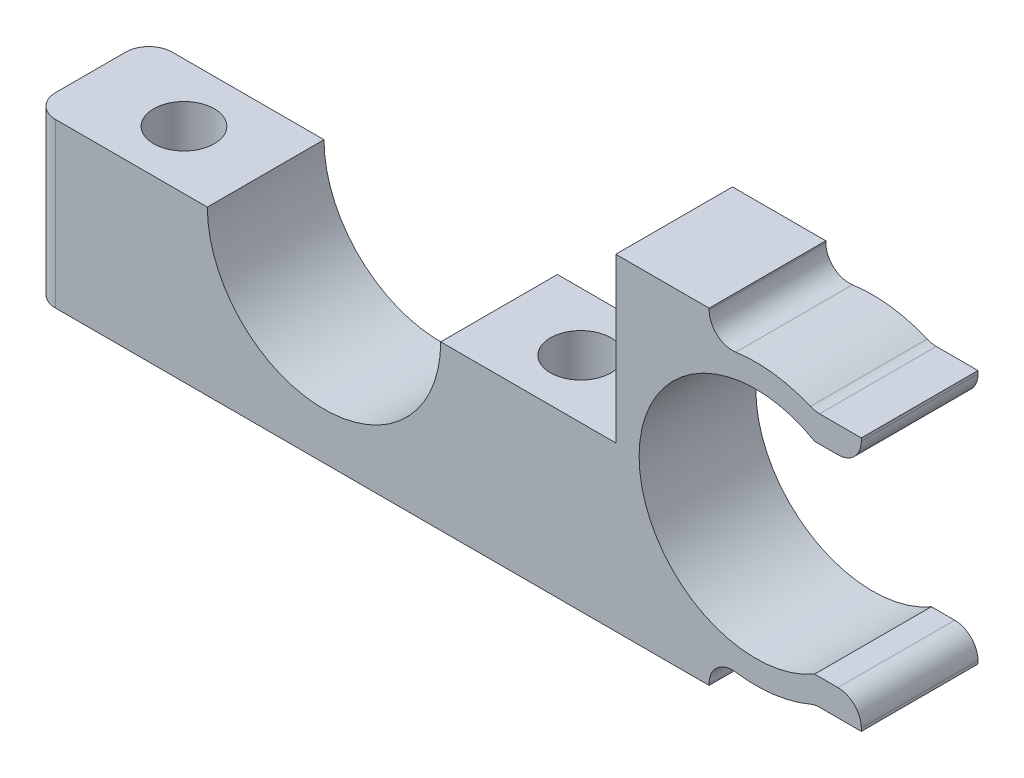
ISO-10303-21;
HEADER;
FILE_DESCRIPTION(('STEP AP214'),'2;1');
FILE_NAME('part.step','',(''),(''),'','','');
FILE_SCHEMA(('AUTOMOTIVE_DESIGN { 1 0 10303 214 1 1 1 1 }'));
ENDSEC;
DATA;
#1=APPLICATION_CONTEXT('core data for automotive mechanical design processes');
#2=APPLICATION_PROTOCOL_DEFINITION('international standard','automotive_design',2000,#1);
#3=PRODUCT_CONTEXT('',#1,'mechanical');
#4=PRODUCT('Part','Part','',(#3));
#5=PRODUCT_RELATED_PRODUCT_CATEGORY('part','',(#4));
#6=PRODUCT_DEFINITION_FORMATION('','',#4);
#7=PRODUCT_DEFINITION_CONTEXT('part definition',#1,'design');
#8=PRODUCT_DEFINITION('design','',#6,#7);
#9=PRODUCT_DEFINITION_SHAPE('','',#8);
#10=(LENGTH_UNIT() NAMED_UNIT(*) SI_UNIT(.MILLI.,.METRE.));
#11=(NAMED_UNIT(*) PLANE_ANGLE_UNIT() SI_UNIT($,.RADIAN.));
#12=(NAMED_UNIT(*) SI_UNIT($,.STERADIAN.) SOLID_ANGLE_UNIT());
#13=UNCERTAINTY_MEASURE_WITH_UNIT(LENGTH_MEASURE(1.E-05),#10,'distance_accuracy_value','');
#14=(GEOMETRIC_REPRESENTATION_CONTEXT(3) GLOBAL_UNCERTAINTY_ASSIGNED_CONTEXT((#13)) GLOBAL_UNIT_ASSIGNED_CONTEXT((#10,
#11,#12)) REPRESENTATION_CONTEXT('',''));
#15=CARTESIAN_POINT('',(0.,0.,0.));
#16=DIRECTION('',(0.,0.,1.));
#17=DIRECTION('',(1.,0.,0.));
#18=AXIS2_PLACEMENT_3D('',#15,#16,#17);
#19=CARTESIAN_POINT('',(0.,0.,10.));
#20=DIRECTION('',(0.,0.,-1.));
#21=DIRECTION('',(-1.,0.,0.));
#22=AXIS2_PLACEMENT_3D('',#19,#20,#21);
#23=CYLINDRICAL_SURFACE('',#22,10.);
#24=CARTESIAN_POINT('',(0.,0.,0.));
#25=DIRECTION('',(0.,0.,-1.));
#26=DIRECTION('',(1.,0.,0.));
#27=AXIS2_PLACEMENT_3D('',#24,#25,#26);
#28=CIRCLE('',#27,10.);
#29=CARTESIAN_POINT('',(10.,0.,0.));
#30=VERTEX_POINT('',#29);
#31=CARTESIAN_POINT('',(-10.,0.,0.));
#32=VERTEX_POINT('',#31);
#33=EDGE_CURVE('E231',#30,#32,#28,.T.);
#34=ORIENTED_EDGE('',*,*,#33,.T.);
#35=DIRECTION('',(0.,0.,-1.));
#36=VECTOR('',#35,1.);
#37=CARTESIAN_POINT('',(-10.,0.,10.));
#38=LINE('',#37,#36);
#39=CARTESIAN_POINT('',(-10.,0.,10.));
#40=VERTEX_POINT('',#39);
#41=EDGE_CURVE('E210',#40,#32,#38,.T.);
#42=ORIENTED_EDGE('',*,*,#41,.F.);
#43=CARTESIAN_POINT('',(0.,0.,10.));
#44=DIRECTION('',(0.,0.,-1.));
#45=DIRECTION('',(1.,0.,0.));
#46=AXIS2_PLACEMENT_3D('',#43,#44,#45);
#47=CIRCLE('',#46,10.);
#48=CARTESIAN_POINT('',(10.,0.,10.));
#49=VERTEX_POINT('',#48);
#50=EDGE_CURVE('E218',#49,#40,#47,.T.);
#51=ORIENTED_EDGE('',*,*,#50,.F.);
#52=DIRECTION('',(0.,0.,-1.));
#53=VECTOR('',#52,1.);
#54=CARTESIAN_POINT('',(10.,0.,10.));
#55=LINE('',#54,#53);
#56=EDGE_CURVE('E340',#49,#30,#55,.T.);
#57=ORIENTED_EDGE('',*,*,#56,.T.);
#58=EDGE_LOOP('',(#34,#42,#51,#57));
#59=FACE_BOUND('',#58,.T.);
#60=ADVANCED_FACE('F33',(#59),#23,.F.);
#61=CARTESIAN_POINT('',(-25.,0.,10.));
#62=DIRECTION('',(0.,-1.,0.));
#63=DIRECTION('',(1.,0.,0.));
#64=AXIS2_PLACEMENT_3D('',#61,#62,#63);
#65=PLANE('',#64);
#66=CARTESIAN_POINT('',(-17.,0.,5.));
#67=DIRECTION('',(0.,1.,0.));
#68=DIRECTION('',(-1.,0.,0.));
#69=AXIS2_PLACEMENT_3D('',#66,#67,#68);
#70=CIRCLE('',#69,2.6);
#71=CARTESIAN_POINT('',(-19.6,0.,5.));
#72=VERTEX_POINT('',#71);
#73=EDGE_CURVE('E761',#72,#72,#70,.T.);
#74=ORIENTED_EDGE('',*,*,#73,.F.);
#75=EDGE_LOOP('',(#74));
#76=FACE_BOUND('',#75,.T.);
#77=DIRECTION('',(-1.,0.,0.));
#78=VECTOR('',#77,1.);
#79=CARTESIAN_POINT('',(-25.,0.,0.));
#80=LINE('',#79,#78);
#81=CARTESIAN_POINT('',(-23.,0.,0.));
#82=VERTEX_POINT('',#81);
#83=EDGE_CURVE('E342',#32,#82,#80,.T.);
#84=ORIENTED_EDGE('',*,*,#83,.T.);
#85=CARTESIAN_POINT('',(-23.,0.,2.));
#86=DIRECTION('',(0.,-1.,0.));
#87=DIRECTION('',(1.,0.,0.));
#88=AXIS2_PLACEMENT_3D('',#85,#86,#87);
#89=CIRCLE('',#88,2.);
#90=CARTESIAN_POINT('',(-25.,0.,2.));
#91=VERTEX_POINT('',#90);
#92=EDGE_CURVE('E48',#82,#91,#89,.F.);
#93=ORIENTED_EDGE('',*,*,#92,.T.);
#94=DIRECTION('',(0.,0.,-1.));
#95=VECTOR('',#94,1.);
#96=CARTESIAN_POINT('',(-25.,0.,10.));
#97=LINE('',#96,#95);
#98=CARTESIAN_POINT('',(-25.,0.,8.));
#99=VERTEX_POINT('',#98);
#100=EDGE_CURVE('E233',#99,#91,#97,.T.);
#101=ORIENTED_EDGE('',*,*,#100,.F.);
#102=CARTESIAN_POINT('',(-23.,0.,8.));
#103=DIRECTION('',(0.,-1.,0.));
#104=DIRECTION('',(1.,0.,0.));
#105=AXIS2_PLACEMENT_3D('',#102,#103,#104);
#106=CIRCLE('',#105,2.);
#107=CARTESIAN_POINT('',(-23.,0.,10.));
#108=VERTEX_POINT('',#107);
#109=EDGE_CURVE('E213',#99,#108,#106,.F.);
#110=ORIENTED_EDGE('',*,*,#109,.T.);
#111=DIRECTION('',(-1.,0.,0.));
#112=VECTOR('',#111,1.);
#113=CARTESIAN_POINT('',(-25.,0.,10.));
#114=LINE('',#113,#112);
#115=EDGE_CURVE('E206',#40,#108,#114,.T.);
#116=ORIENTED_EDGE('',*,*,#115,.F.);
#117=ORIENTED_EDGE('',*,*,#41,.T.);
#118=EDGE_LOOP('',(#84,#93,#101,#110,#116,#117));
#119=FACE_BOUND('',#118,.T.);
#120=ADVANCED_FACE('F208',(#76,#119),#65,.F.);
#121=CARTESIAN_POINT('',(-25.,0.,10.));
#122=DIRECTION('',(1.,0.,0.));
#123=DIRECTION('',(0.,0.,-1.));
#124=AXIS2_PLACEMENT_3D('',#121,#122,#123);
#125=PLANE('',#124);
#126=ORIENTED_EDGE('',*,*,#100,.T.);
#127=DIRECTION('',(0.,-1.,0.));
#128=VECTOR('',#127,1.);
#129=CARTESIAN_POINT('',(-25.,0.,2.));
#130=LINE('',#129,#128);
#131=CARTESIAN_POINT('',(-25.,-14.,2.));
#132=VERTEX_POINT('',#131);
#133=EDGE_CURVE('E261',#91,#132,#130,.T.);
#134=ORIENTED_EDGE('',*,*,#133,.T.);
#135=DIRECTION('',(0.,0.,-1.));
#136=VECTOR('',#135,1.);
#137=CARTESIAN_POINT('',(-25.,-14.,10.));
#138=LINE('',#137,#136);
#139=CARTESIAN_POINT('',(-25.,-14.,8.));
#140=VERTEX_POINT('',#139);
#141=EDGE_CURVE('E238',#140,#132,#138,.T.);
#142=ORIENTED_EDGE('',*,*,#141,.F.);
#143=DIRECTION('',(0.,-1.,0.));
#144=VECTOR('',#143,1.);
#145=CARTESIAN_POINT('',(-25.,0.,8.));
#146=LINE('',#145,#144);
#147=EDGE_CURVE('E55',#140,#99,#146,.F.);
#148=ORIENTED_EDGE('',*,*,#147,.T.);
#149=EDGE_LOOP('',(#126,#134,#142,#148));
#150=FACE_BOUND('',#149,.T.);
#151=ADVANCED_FACE('F402',(#150),#125,.F.);
#152=CARTESIAN_POINT('',(25.,-14.,10.));
#153=DIRECTION('',(0.,1.,0.));
#154=DIRECTION('',(-1.,0.,0.));
#155=AXIS2_PLACEMENT_3D('',#152,#153,#154);
#156=PLANE('',#155);
#157=CARTESIAN_POINT('',(17.,-14.0000000000001,4.99999999999999));
#158=DIRECTION('',(0.,1.,0.));
#159=DIRECTION('',(-1.,0.,0.));
#160=AXIS2_PLACEMENT_3D('',#157,#158,#159);
#161=CIRCLE('',#160,2.6);
#162=CARTESIAN_POINT('',(14.4,-14.0000000000001,4.99999999999999));
#163=VERTEX_POINT('',#162);
#164=EDGE_CURVE('E756',#163,#163,#161,.T.);
#165=ORIENTED_EDGE('',*,*,#164,.T.);
#166=EDGE_LOOP('',(#165));
#167=FACE_BOUND('',#166,.T.);
#168=CARTESIAN_POINT('',(-17.,-14.0000000000001,5.));
#169=DIRECTION('',(0.,1.,0.));
#170=DIRECTION('',(-1.,0.,0.));
#171=AXIS2_PLACEMENT_3D('',#168,#169,#170);
#172=CIRCLE('',#171,2.6);
#173=CARTESIAN_POINT('',(-19.6,-14.0000000000001,5.));
#174=VERTEX_POINT('',#173);
#175=EDGE_CURVE('E343',#174,#174,#172,.T.);
#176=ORIENTED_EDGE('',*,*,#175,.T.);
#177=EDGE_LOOP('',(#176));
#178=FACE_BOUND('',#177,.T.);
#179=ORIENTED_EDGE('',*,*,#141,.T.);
#180=CARTESIAN_POINT('',(-23.,-14.0000000000001,2.));
#181=DIRECTION('',(0.,1.,0.));
#182=DIRECTION('',(-1.,0.,0.));
#183=AXIS2_PLACEMENT_3D('',#180,#181,#182);
#184=CIRCLE('',#183,2.);
#185=CARTESIAN_POINT('',(-23.,-14.0000000000001,0.));
#186=VERTEX_POINT('',#185);
#187=EDGE_CURVE('E266',#132,#186,#184,.F.);
#188=ORIENTED_EDGE('',*,*,#187,.T.);
#189=DIRECTION('',(1.,0.,0.));
#190=VECTOR('',#189,1.);
#191=CARTESIAN_POINT('',(25.,-14.,0.));
#192=LINE('',#191,#190);
#193=CARTESIAN_POINT('',(33.,-14.,0.));
#194=VERTEX_POINT('',#193);
#195=EDGE_CURVE('E345',#186,#194,#192,.T.);
#196=ORIENTED_EDGE('',*,*,#195,.T.);
#197=DIRECTION('',(0.,0.,-1.));
#198=VECTOR('',#197,1.);
#199=CARTESIAN_POINT('',(33.,-14.,10.));
#200=LINE('',#199,#198);
#201=CARTESIAN_POINT('',(33.,-14.,10.));
#202=VERTEX_POINT('',#201);
#203=EDGE_CURVE('E395',#202,#194,#200,.T.);
#204=ORIENTED_EDGE('',*,*,#203,.F.);
#205=DIRECTION('',(1.,0.,0.));
#206=VECTOR('',#205,1.);
#207=CARTESIAN_POINT('',(-25.,-14.,10.));
#208=LINE('',#207,#206);
#209=CARTESIAN_POINT('',(-23.,-14.,10.));
#210=VERTEX_POINT('',#209);
#211=EDGE_CURVE('E217',#210,#202,#208,.T.);
#212=ORIENTED_EDGE('',*,*,#211,.F.);
#213=CARTESIAN_POINT('',(-23.,-14.0000000000001,8.));
#214=DIRECTION('',(0.,1.,0.));
#215=DIRECTION('',(-1.,0.,0.));
#216=AXIS2_PLACEMENT_3D('',#213,#214,#215);
#217=CIRCLE('',#216,2.);
#218=EDGE_CURVE('E264',#210,#140,#217,.F.);
#219=ORIENTED_EDGE('',*,*,#218,.T.);
#220=EDGE_LOOP('',(#179,#188,#196,#204,#212,#219));
#221=FACE_BOUND('',#220,.T.);
#222=ADVANCED_FACE('F399',(#167,#178,#221),#156,.F.);
#223=CARTESIAN_POINT('',(33.,-11.3137084989848,10.));
#224=DIRECTION('',(-1.,0.,0.));
#225=DIRECTION('',(0.,0.,1.));
#226=AXIS2_PLACEMENT_3D('',#223,#224,#225);
#227=PLANE('',#226);
#228=DIRECTION('',(0.,1.,0.));
#229=VECTOR('',#228,1.);
#230=CARTESIAN_POINT('',(33.,-11.3137084989848,0.));
#231=LINE('',#230,#229);
#232=CARTESIAN_POINT('',(33.,-13.856406460551,0.));
#233=VERTEX_POINT('',#232);
#234=EDGE_CURVE('E347',#194,#233,#231,.T.);
#235=ORIENTED_EDGE('',*,*,#234,.T.);
#236=DIRECTION('',(0.,0.,1.));
#237=VECTOR('',#236,1.);
#238=CARTESIAN_POINT('',(33.,-13.856406460551,10.));
#239=LINE('',#238,#237);
#240=CARTESIAN_POINT('',(33.,-13.856406460551,10.));
#241=VERTEX_POINT('',#240);
#242=EDGE_CURVE('E285',#233,#241,#239,.T.);
#243=ORIENTED_EDGE('',*,*,#242,.T.);
#244=DIRECTION('',(0.,1.,0.));
#245=VECTOR('',#244,1.);
#246=CARTESIAN_POINT('',(33.,-11.3137084989848,10.));
#247=LINE('',#246,#245);
#248=EDGE_CURVE('E409',#202,#241,#247,.T.);
#249=ORIENTED_EDGE('',*,*,#248,.F.);
#250=ORIENTED_EDGE('',*,*,#203,.T.);
#251=EDGE_LOOP('',(#235,#243,#249,#250));
#252=FACE_BOUND('',#251,.T.);
#253=ADVANCED_FACE('F557',(#252),#227,.F.);
#254=CARTESIAN_POINT('',(37.,0.,10.));
#255=DIRECTION('',(0.,0.,-1.));
#256=DIRECTION('',(-1.,0.,0.));
#257=AXIS2_PLACEMENT_3D('',#254,#255,#256);
#258=CYLINDRICAL_SURFACE('',#257,12.);
#259=CARTESIAN_POINT('',(37.,0.,0.));
#260=DIRECTION('',(0.,0.,1.));
#261=DIRECTION('',(1.,0.,0.));
#262=AXIS2_PLACEMENT_3D('',#259,#260,#261);
#263=CIRCLE('',#262,12.);
#264=CARTESIAN_POINT('',(35.2857142857143,-11.8769198233294,0.));
#265=VERTEX_POINT('',#264);
#266=CARTESIAN_POINT('',(41.6828484267329,-11.0485714285714,0.));
#267=VERTEX_POINT('',#266);
#268=EDGE_CURVE('E350',#265,#267,#263,.T.);
#269=ORIENTED_EDGE('',*,*,#268,.T.);
#270=DIRECTION('',(0.,0.,-1.));
#271=VECTOR('',#270,1.);
#272=CARTESIAN_POINT('',(41.6828484267329,-11.0485714285714,10.));
#273=LINE('',#272,#271);
#274=CARTESIAN_POINT('',(41.6828484267329,-11.0485714285714,10.));
#275=VERTEX_POINT('',#274);
#276=EDGE_CURVE('E283',#267,#275,#273,.F.);
#277=ORIENTED_EDGE('',*,*,#276,.T.);
#278=CARTESIAN_POINT('',(37.,0.,10.));
#279=DIRECTION('',(0.,0.,1.));
#280=DIRECTION('',(1.,0.,0.));
#281=AXIS2_PLACEMENT_3D('',#278,#279,#280);
#282=CIRCLE('',#281,12.);
#283=CARTESIAN_POINT('',(35.2857142857143,-11.8769198233294,10.));
#284=VERTEX_POINT('',#283);
#285=EDGE_CURVE('E411',#284,#275,#282,.T.);
#286=ORIENTED_EDGE('',*,*,#285,.F.);
#287=DIRECTION('',(0.,0.,-1.));
#288=VECTOR('',#287,1.);
#289=CARTESIAN_POINT('',(35.2857142857143,-11.8769198233294,10.));
#290=LINE('',#289,#288);
#291=EDGE_CURVE('E280',#284,#265,#290,.T.);
#292=ORIENTED_EDGE('',*,*,#291,.T.);
#293=EDGE_LOOP('',(#269,#277,#286,#292));
#294=FACE_BOUND('',#293,.T.);
#295=ADVANCED_FACE('F480',(#294),#258,.T.);
#296=CARTESIAN_POINT('',(42.0406249612523,-10.89,10.));
#297=DIRECTION('',(0.,1.,0.));
#298=DIRECTION('',(-1.,0.,0.));
#299=AXIS2_PLACEMENT_3D('',#296,#297,#298);
#300=PLANE('',#299);
#301=DIRECTION('',(1.,0.,0.));
#302=VECTOR('',#301,1.);
#303=CARTESIAN_POINT('',(42.0406249612523,-10.89,10.));
#304=LINE('',#303,#302);
#305=CARTESIAN_POINT('',(42.4633231645218,-10.89,10.));
#306=VERTEX_POINT('',#305);
#307=CARTESIAN_POINT('',(46.0406249612523,-10.89,10.));
#308=VERTEX_POINT('',#307);
#309=EDGE_CURVE('E416',#306,#308,#304,.T.);
#310=ORIENTED_EDGE('',*,*,#309,.F.);
#311=DIRECTION('',(0.,0.,1.));
#312=VECTOR('',#311,1.);
#313=CARTESIAN_POINT('',(42.4633231645218,-10.89,0.));
#314=LINE('',#313,#312);
#315=CARTESIAN_POINT('',(42.4633231645218,-10.89,0.));
#316=VERTEX_POINT('',#315);
#317=EDGE_CURVE('E277',#306,#316,#314,.F.);
#318=ORIENTED_EDGE('',*,*,#317,.T.);
#319=DIRECTION('',(1.,0.,0.));
#320=VECTOR('',#319,1.);
#321=CARTESIAN_POINT('',(42.0406249612523,-10.89,0.));
#322=LINE('',#321,#320);
#323=CARTESIAN_POINT('',(46.0406249612523,-10.89,0.));
#324=VERTEX_POINT('',#323);
#325=EDGE_CURVE('E353',#316,#324,#322,.T.);
#326=ORIENTED_EDGE('',*,*,#325,.T.);
#327=DIRECTION('',(0.,0.,-1.));
#328=VECTOR('',#327,1.);
#329=CARTESIAN_POINT('',(46.0406249612523,-10.89,10.));
#330=LINE('',#329,#328);
#331=EDGE_CURVE('E392',#308,#324,#330,.T.);
#332=ORIENTED_EDGE('',*,*,#331,.F.);
#333=EDGE_LOOP('',(#310,#318,#326,#332));
#334=FACE_BOUND('',#333,.T.);
#335=ADVANCED_FACE('F474',(#334),#300,.F.);
#336=CARTESIAN_POINT('',(46.0406249612523,-8.63667181268341,10.));
#337=DIRECTION('',(-1.,0.,0.));
#338=DIRECTION('',(0.,-1.,0.));
#339=AXIS2_PLACEMENT_3D('',#336,#337,#338);
#340=PLANE('',#339);
#341=DIRECTION('',(0.,1.,0.));
#342=VECTOR('',#341,1.);
#343=CARTESIAN_POINT('',(46.0406249612523,-8.63667181268341,0.));
#344=LINE('',#343,#342);
#345=CARTESIAN_POINT('',(46.0406249612523,-10.6366718126834,0.));
#346=VERTEX_POINT('',#345);
#347=EDGE_CURVE('E355',#324,#346,#344,.T.);
#348=ORIENTED_EDGE('',*,*,#347,.T.);
#349=DIRECTION('',(0.,0.,-1.));
#350=VECTOR('',#349,1.);
#351=CARTESIAN_POINT('',(46.0406249612523,-10.6366718126834,10.));
#352=LINE('',#351,#350);
#353=CARTESIAN_POINT('',(46.0406249612523,-10.6366718126834,10.));
#354=VERTEX_POINT('',#353);
#355=EDGE_CURVE('E247',#346,#354,#352,.F.);
#356=ORIENTED_EDGE('',*,*,#355,.T.);
#357=DIRECTION('',(0.,1.,0.));
#358=VECTOR('',#357,1.);
#359=CARTESIAN_POINT('',(46.0406249612523,-8.63667181268341,10.));
#360=LINE('',#359,#358);
#361=EDGE_CURVE('E418',#308,#354,#360,.T.);
#362=ORIENTED_EDGE('',*,*,#361,.F.);
#363=ORIENTED_EDGE('',*,*,#331,.T.);
#364=EDGE_LOOP('',(#348,#356,#362,#363));
#365=FACE_BOUND('',#364,.T.);
#366=ADVANCED_FACE('F468',(#365),#340,.F.);
#367=CARTESIAN_POINT('',(42.0406249612523,-8.63667181268341,10.));
#368=DIRECTION('',(0.,-1.,0.));
#369=DIRECTION('',(1.,0.,0.));
#370=AXIS2_PLACEMENT_3D('',#367,#368,#369);
#371=PLANE('',#370);
#372=DIRECTION('',(-1.,0.,0.));
#373=VECTOR('',#372,1.);
#374=CARTESIAN_POINT('',(42.0406249612523,-8.63667181268341,10.));
#375=LINE('',#374,#373);
#376=CARTESIAN_POINT('',(44.0406249612523,-8.63667181268341,10.));
#377=VERTEX_POINT('',#376);
#378=CARTESIAN_POINT('',(42.0406249612523,-8.63667181268341,10.));
#379=VERTEX_POINT('',#378);
#380=EDGE_CURVE('E420',#377,#379,#375,.T.);
#381=ORIENTED_EDGE('',*,*,#380,.F.);
#382=DIRECTION('',(0.,0.,-1.));
#383=VECTOR('',#382,1.);
#384=CARTESIAN_POINT('',(44.0406249612523,-8.63667181268341,10.));
#385=LINE('',#384,#383);
#386=CARTESIAN_POINT('',(44.0406249612523,-8.63667181268341,0.));
#387=VERTEX_POINT('',#386);
#388=EDGE_CURVE('E232',#377,#387,#385,.T.);
#389=ORIENTED_EDGE('',*,*,#388,.T.);
#390=DIRECTION('',(-1.,0.,0.));
#391=VECTOR('',#390,1.);
#392=CARTESIAN_POINT('',(42.0406249612523,-8.63667181268341,0.));
#393=LINE('',#392,#391);
#394=CARTESIAN_POINT('',(42.0406249612523,-8.63667181268341,0.));
#395=VERTEX_POINT('',#394);
#396=EDGE_CURVE('E358',#387,#395,#393,.T.);
#397=ORIENTED_EDGE('',*,*,#396,.T.);
#398=DIRECTION('',(0.,0.,-1.));
#399=VECTOR('',#398,1.);
#400=CARTESIAN_POINT('',(42.0406249612523,-8.63667181268341,10.));
#401=LINE('',#400,#399);
#402=EDGE_CURVE('E389',#379,#395,#401,.T.);
#403=ORIENTED_EDGE('',*,*,#402,.F.);
#404=EDGE_LOOP('',(#381,#389,#397,#403));
#405=FACE_BOUND('',#404,.T.);
#406=ADVANCED_FACE('F460',(#405),#371,.F.);
#407=CARTESIAN_POINT('',(37.,0.,10.));
#408=DIRECTION('',(0.,0.,-1.));
#409=DIRECTION('',(-1.,0.,0.));
#410=AXIS2_PLACEMENT_3D('',#407,#408,#409);
#411=CYLINDRICAL_SURFACE('',#410,9.99999999999999);
#412=CARTESIAN_POINT('',(37.,0.,0.));
#413=DIRECTION('',(0.,0.,-1.));
#414=DIRECTION('',(1.,0.,0.));
#415=AXIS2_PLACEMENT_3D('',#412,#413,#414);
#416=CIRCLE('',#415,9.99999999999999);
#417=CARTESIAN_POINT('',(42.0406249612523,8.6366718126834,0.));
#418=VERTEX_POINT('',#417);
#419=EDGE_CURVE('E360',#395,#418,#416,.T.);
#420=ORIENTED_EDGE('',*,*,#419,.T.);
#421=DIRECTION('',(0.,0.,-1.));
#422=VECTOR('',#421,1.);
#423=CARTESIAN_POINT('',(42.0406249612523,8.6366718126834,10.));
#424=LINE('',#423,#422);
#425=CARTESIAN_POINT('',(42.0406249612523,8.6366718126834,10.));
#426=VERTEX_POINT('',#425);
#427=EDGE_CURVE('E386',#426,#418,#424,.T.);
#428=ORIENTED_EDGE('',*,*,#427,.F.);
#429=CARTESIAN_POINT('',(37.,0.,10.));
#430=DIRECTION('',(0.,0.,-1.));
#431=DIRECTION('',(1.,0.,0.));
#432=AXIS2_PLACEMENT_3D('',#429,#430,#431);
#433=CIRCLE('',#432,9.99999999999999);
#434=EDGE_CURVE('E422',#379,#426,#433,.T.);
#435=ORIENTED_EDGE('',*,*,#434,.F.);
#436=ORIENTED_EDGE('',*,*,#402,.T.);
#437=EDGE_LOOP('',(#420,#428,#435,#436));
#438=FACE_BOUND('',#437,.T.);
#439=ADVANCED_FACE('F457',(#438),#411,.F.);
#440=CARTESIAN_POINT('',(42.0406249612523,8.6366718126834,10.));
#441=DIRECTION('',(0.,1.,0.));
#442=DIRECTION('',(-1.,0.,0.));
#443=AXIS2_PLACEMENT_3D('',#440,#441,#442);
#444=PLANE('',#443);
#445=DIRECTION('',(1.,0.,0.));
#446=VECTOR('',#445,1.);
#447=CARTESIAN_POINT('',(42.0406249612523,8.6366718126834,0.));
#448=LINE('',#447,#446);
#449=CARTESIAN_POINT('',(44.0406249612523,8.63667181268341,0.));
#450=VERTEX_POINT('',#449);
#451=EDGE_CURVE('E362',#418,#450,#448,.T.);
#452=ORIENTED_EDGE('',*,*,#451,.T.);
#453=DIRECTION('',(0.,0.,-1.));
#454=VECTOR('',#453,1.);
#455=CARTESIAN_POINT('',(44.0406249612523,8.63667181268341,10.));
#456=LINE('',#455,#454);
#457=CARTESIAN_POINT('',(44.0406249612523,8.63667181268341,10.));
#458=VERTEX_POINT('',#457);
#459=EDGE_CURVE('E258',#450,#458,#456,.F.);
#460=ORIENTED_EDGE('',*,*,#459,.T.);
#461=DIRECTION('',(1.,0.,0.));
#462=VECTOR('',#461,1.);
#463=CARTESIAN_POINT('',(42.0406249612523,8.6366718126834,10.));
#464=LINE('',#463,#462);
#465=EDGE_CURVE('E424',#426,#458,#464,.T.);
#466=ORIENTED_EDGE('',*,*,#465,.F.);
#467=ORIENTED_EDGE('',*,*,#427,.T.);
#468=EDGE_LOOP('',(#452,#460,#466,#467));
#469=FACE_BOUND('',#468,.T.);
#470=ADVANCED_FACE('F448',(#469),#444,.F.);
#471=CARTESIAN_POINT('',(46.0406249612523,10.89,10.));
#472=DIRECTION('',(-1.,0.,0.));
#473=DIRECTION('',(0.,-1.,0.));
#474=AXIS2_PLACEMENT_3D('',#471,#472,#473);
#475=PLANE('',#474);
#476=DIRECTION('',(0.,1.,0.));
#477=VECTOR('',#476,1.);
#478=CARTESIAN_POINT('',(46.0406249612523,10.89,10.));
#479=LINE('',#478,#477);
#480=CARTESIAN_POINT('',(46.0406249612523,10.6366718126834,10.));
#481=VERTEX_POINT('',#480);
#482=CARTESIAN_POINT('',(46.0406249612523,10.89,10.));
#483=VERTEX_POINT('',#482);
#484=EDGE_CURVE('E427',#481,#483,#479,.T.);
#485=ORIENTED_EDGE('',*,*,#484,.F.);
#486=DIRECTION('',(0.,0.,-1.));
#487=VECTOR('',#486,1.);
#488=CARTESIAN_POINT('',(46.0406249612523,10.6366718126834,10.));
#489=LINE('',#488,#487);
#490=CARTESIAN_POINT('',(46.0406249612523,10.6366718126834,0.));
#491=VERTEX_POINT('',#490);
#492=EDGE_CURVE('E255',#481,#491,#489,.T.);
#493=ORIENTED_EDGE('',*,*,#492,.T.);
#494=DIRECTION('',(0.,1.,0.));
#495=VECTOR('',#494,1.);
#496=CARTESIAN_POINT('',(46.0406249612523,10.89,0.));
#497=LINE('',#496,#495);
#498=CARTESIAN_POINT('',(46.0406249612523,10.89,0.));
#499=VERTEX_POINT('',#498);
#500=EDGE_CURVE('E365',#491,#499,#497,.T.);
#501=ORIENTED_EDGE('',*,*,#500,.T.);
#502=DIRECTION('',(0.,0.,-1.));
#503=VECTOR('',#502,1.);
#504=CARTESIAN_POINT('',(46.0406249612523,10.89,10.));
#505=LINE('',#504,#503);
#506=EDGE_CURVE('E383',#483,#499,#505,.T.);
#507=ORIENTED_EDGE('',*,*,#506,.F.);
#508=EDGE_LOOP('',(#485,#493,#501,#507));
#509=FACE_BOUND('',#508,.T.);
#510=ADVANCED_FACE('F441',(#509),#475,.F.);
#511=CARTESIAN_POINT('',(42.0406249612523,10.89,10.));
#512=DIRECTION('',(0.,-1.,0.));
#513=DIRECTION('',(1.,0.,0.));
#514=AXIS2_PLACEMENT_3D('',#511,#512,#513);
#515=PLANE('',#514);
#516=DIRECTION('',(-1.,0.,0.));
#517=VECTOR('',#516,1.);
#518=CARTESIAN_POINT('',(42.0406249612523,10.89,0.));
#519=LINE('',#518,#517);
#520=CARTESIAN_POINT('',(42.4633231645218,10.89,0.));
#521=VERTEX_POINT('',#520);
#522=EDGE_CURVE('E318',#499,#521,#519,.T.);
#523=ORIENTED_EDGE('',*,*,#522,.T.);
#524=DIRECTION('',(0.,0.,1.));
#525=VECTOR('',#524,1.);
#526=CARTESIAN_POINT('',(42.4633231645218,10.89,10.));
#527=LINE('',#526,#525);
#528=CARTESIAN_POINT('',(42.4633231645218,10.89,10.));
#529=VERTEX_POINT('',#528);
#530=EDGE_CURVE('E275',#521,#529,#527,.T.);
#531=ORIENTED_EDGE('',*,*,#530,.T.);
#532=DIRECTION('',(-1.,0.,0.));
#533=VECTOR('',#532,1.);
#534=CARTESIAN_POINT('',(42.0406249612523,10.89,10.));
#535=LINE('',#534,#533);
#536=EDGE_CURVE('E334',#483,#529,#535,.T.);
#537=ORIENTED_EDGE('',*,*,#536,.F.);
#538=ORIENTED_EDGE('',*,*,#506,.T.);
#539=EDGE_LOOP('',(#523,#531,#537,#538));
#540=FACE_BOUND('',#539,.T.);
#541=ADVANCED_FACE('F439',(#540),#515,.F.);
#542=CARTESIAN_POINT('',(37.,0.,10.));
#543=DIRECTION('',(0.,0.,-1.));
#544=DIRECTION('',(-1.,0.,0.));
#545=AXIS2_PLACEMENT_3D('',#542,#543,#544);
#546=CYLINDRICAL_SURFACE('',#545,12.);
#547=CARTESIAN_POINT('',(37.,0.,10.));
#548=DIRECTION('',(0.,0.,1.));
#549=DIRECTION('',(1.,0.,0.));
#550=AXIS2_PLACEMENT_3D('',#547,#548,#549);
#551=CIRCLE('',#550,12.);
#552=CARTESIAN_POINT('',(41.6828484267329,11.0485714285714,10.));
#553=VERTEX_POINT('',#552);
#554=CARTESIAN_POINT('',(35.2857142857143,11.8769198233294,10.));
#555=VERTEX_POINT('',#554);
#556=EDGE_CURVE('E324',#553,#555,#551,.T.);
#557=ORIENTED_EDGE('',*,*,#556,.F.);
#558=DIRECTION('',(0.,0.,-1.));
#559=VECTOR('',#558,1.);
#560=CARTESIAN_POINT('',(41.6828484267329,11.0485714285714,10.));
#561=LINE('',#560,#559);
#562=CARTESIAN_POINT('',(41.6828484267329,11.0485714285714,0.));
#563=VERTEX_POINT('',#562);
#564=EDGE_CURVE('E272',#553,#563,#561,.T.);
#565=ORIENTED_EDGE('',*,*,#564,.T.);
#566=CARTESIAN_POINT('',(37.,0.,0.));
#567=DIRECTION('',(0.,0.,1.));
#568=DIRECTION('',(1.,0.,0.));
#569=AXIS2_PLACEMENT_3D('',#566,#567,#568);
#570=CIRCLE('',#569,12.);
#571=CARTESIAN_POINT('',(35.2857142857143,11.8769198233294,0.));
#572=VERTEX_POINT('',#571);
#573=EDGE_CURVE('E307',#563,#572,#570,.T.);
#574=ORIENTED_EDGE('',*,*,#573,.T.);
#575=DIRECTION('',(0.,0.,-1.));
#576=VECTOR('',#575,1.);
#577=CARTESIAN_POINT('',(35.2857142857143,11.8769198233294,10.));
#578=LINE('',#577,#576);
#579=EDGE_CURVE('E270',#572,#555,#578,.F.);
#580=ORIENTED_EDGE('',*,*,#579,.T.);
#581=EDGE_LOOP('',(#557,#565,#574,#580));
#582=FACE_BOUND('',#581,.T.);
#583=ADVANCED_FACE('F315',(#582),#546,.T.);
#584=CARTESIAN_POINT('',(33.,14.,10.));
#585=DIRECTION('',(-1.,0.,0.));
#586=DIRECTION('',(0.,-1.,0.));
#587=AXIS2_PLACEMENT_3D('',#584,#585,#586);
#588=PLANE('',#587);
#589=DIRECTION('',(0.,1.,0.));
#590=VECTOR('',#589,1.);
#591=CARTESIAN_POINT('',(33.,14.,10.));
#592=LINE('',#591,#590);
#593=CARTESIAN_POINT('',(33.,13.856406460551,10.));
#594=VERTEX_POINT('',#593);
#595=CARTESIAN_POINT('',(33.,14.,10.));
#596=VERTEX_POINT('',#595);
#597=EDGE_CURVE('E322',#594,#596,#592,.T.);
#598=ORIENTED_EDGE('',*,*,#597,.F.);
#599=DIRECTION('',(0.,0.,1.));
#600=VECTOR('',#599,1.);
#601=CARTESIAN_POINT('',(33.,13.856406460551,0.));
#602=LINE('',#601,#600);
#603=CARTESIAN_POINT('',(33.,13.856406460551,0.));
#604=VERTEX_POINT('',#603);
#605=EDGE_CURVE('E287',#594,#604,#602,.F.);
#606=ORIENTED_EDGE('',*,*,#605,.T.);
#607=DIRECTION('',(0.,1.,0.));
#608=VECTOR('',#607,1.);
#609=CARTESIAN_POINT('',(33.,14.,0.));
#610=LINE('',#609,#608);
#611=CARTESIAN_POINT('',(33.,14.,0.));
#612=VERTEX_POINT('',#611);
#613=EDGE_CURVE('E309',#604,#612,#610,.T.);
#614=ORIENTED_EDGE('',*,*,#613,.T.);
#615=DIRECTION('',(0.,0.,-1.));
#616=VECTOR('',#615,1.);
#617=CARTESIAN_POINT('',(33.,14.,10.));
#618=LINE('',#617,#616);
#619=EDGE_CURVE('E328',#596,#612,#618,.T.);
#620=ORIENTED_EDGE('',*,*,#619,.F.);
#621=EDGE_LOOP('',(#598,#606,#614,#620));
#622=FACE_BOUND('',#621,.T.);
#623=ADVANCED_FACE('F326',(#622),#588,.F.);
#624=CARTESIAN_POINT('',(25.,14.,10.));
#625=DIRECTION('',(0.,-1.,0.));
#626=DIRECTION('',(1.,0.,0.));
#627=AXIS2_PLACEMENT_3D('',#624,#625,#626);
#628=PLANE('',#627);
#629=DIRECTION('',(-1.,0.,0.));
#630=VECTOR('',#629,1.);
#631=CARTESIAN_POINT('',(25.,14.,0.));
#632=LINE('',#631,#630);
#633=CARTESIAN_POINT('',(25.,14.,0.));
#634=VERTEX_POINT('',#633);
#635=EDGE_CURVE('E370',#612,#634,#632,.T.);
#636=ORIENTED_EDGE('',*,*,#635,.T.);
#637=DIRECTION('',(0.,0.,-1.));
#638=VECTOR('',#637,1.);
#639=CARTESIAN_POINT('',(25.,14.,10.));
#640=LINE('',#639,#638);
#641=CARTESIAN_POINT('',(25.,14.,10.));
#642=VERTEX_POINT('',#641);
#643=EDGE_CURVE('E379',#642,#634,#640,.T.);
#644=ORIENTED_EDGE('',*,*,#643,.F.);
#645=DIRECTION('',(-1.,0.,0.));
#646=VECTOR('',#645,1.);
#647=CARTESIAN_POINT('',(25.,14.,10.));
#648=LINE('',#647,#646);
#649=EDGE_CURVE('E330',#596,#642,#648,.T.);
#650=ORIENTED_EDGE('',*,*,#649,.F.);
#651=ORIENTED_EDGE('',*,*,#619,.T.);
#652=EDGE_LOOP('',(#636,#644,#650,#651));
#653=FACE_BOUND('',#652,.T.);
#654=ADVANCED_FACE('F604',(#653),#628,.F.);
#655=CARTESIAN_POINT('',(25.,14.,10.));
#656=DIRECTION('',(1.,0.,0.));
#657=DIRECTION('',(0.,1.,0.));
#658=AXIS2_PLACEMENT_3D('',#655,#656,#657);
#659=PLANE('',#658);
#660=DIRECTION('',(0.,-1.,0.));
#661=VECTOR('',#660,1.);
#662=CARTESIAN_POINT('',(25.,14.,0.));
#663=LINE('',#662,#661);
#664=CARTESIAN_POINT('',(25.,0.,0.));
#665=VERTEX_POINT('',#664);
#666=EDGE_CURVE('E372',#634,#665,#663,.T.);
#667=ORIENTED_EDGE('',*,*,#666,.T.);
#668=DIRECTION('',(0.,0.,-1.));
#669=VECTOR('',#668,1.);
#670=CARTESIAN_POINT('',(25.,0.,10.));
#671=LINE('',#670,#669);
#672=CARTESIAN_POINT('',(25.,0.,10.));
#673=VERTEX_POINT('',#672);
#674=EDGE_CURVE('E376',#673,#665,#671,.T.);
#675=ORIENTED_EDGE('',*,*,#674,.F.);
#676=DIRECTION('',(0.,-1.,0.));
#677=VECTOR('',#676,1.);
#678=CARTESIAN_POINT('',(25.,14.,10.));
#679=LINE('',#678,#677);
#680=EDGE_CURVE('E332',#642,#673,#679,.T.);
#681=ORIENTED_EDGE('',*,*,#680,.F.);
#682=ORIENTED_EDGE('',*,*,#643,.T.);
#683=EDGE_LOOP('',(#667,#675,#681,#682));
#684=FACE_BOUND('',#683,.T.);
#685=ADVANCED_FACE('F571',(#684),#659,.F.);
#686=CARTESIAN_POINT('',(10.,0.,10.));
#687=DIRECTION('',(0.,-1.,0.));
#688=DIRECTION('',(1.,0.,0.));
#689=AXIS2_PLACEMENT_3D('',#686,#687,#688);
#690=PLANE('',#689);
#691=CARTESIAN_POINT('',(17.,0.,4.99999999999999));
#692=DIRECTION('',(0.,1.,0.));
#693=DIRECTION('',(-1.,0.,0.));
#694=AXIS2_PLACEMENT_3D('',#691,#692,#693);
#695=CIRCLE('',#694,2.6);
#696=CARTESIAN_POINT('',(14.4,0.,4.99999999999999));
#697=VERTEX_POINT('',#696);
#698=EDGE_CURVE('E759',#697,#697,#695,.T.);
#699=ORIENTED_EDGE('',*,*,#698,.F.);
#700=EDGE_LOOP('',(#699));
#701=FACE_BOUND('',#700,.T.);
#702=DIRECTION('',(-1.,0.,0.));
#703=VECTOR('',#702,1.);
#704=CARTESIAN_POINT('',(10.,0.,0.));
#705=LINE('',#704,#703);
#706=EDGE_CURVE('E228',#665,#30,#705,.T.);
#707=ORIENTED_EDGE('',*,*,#706,.T.);
#708=ORIENTED_EDGE('',*,*,#56,.F.);
#709=DIRECTION('',(-1.,0.,0.));
#710=VECTOR('',#709,1.);
#711=CARTESIAN_POINT('',(10.,0.,10.));
#712=LINE('',#711,#710);
#713=EDGE_CURVE('E224',#673,#49,#712,.T.);
#714=ORIENTED_EDGE('',*,*,#713,.F.);
#715=ORIENTED_EDGE('',*,*,#674,.T.);
#716=EDGE_LOOP('',(#707,#708,#714,#715));
#717=FACE_BOUND('',#716,.T.);
#718=ADVANCED_FACE('F566',(#701,#717),#690,.F.);
#719=CARTESIAN_POINT('',(0.,0.,10.));
#720=DIRECTION('',(0.,0.,1.));
#721=DIRECTION('',(1.,0.,0.));
#722=AXIS2_PLACEMENT_3D('',#719,#720,#721);
#723=PLANE('',#722);
#724=ORIENTED_EDGE('',*,*,#361,.T.);
#725=CARTESIAN_POINT('',(44.0406249612523,-10.6366718126834,10.));
#726=DIRECTION('',(0.,0.,1.));
#727=DIRECTION('',(1.,0.,0.));
#728=AXIS2_PLACEMENT_3D('',#725,#726,#727);
#729=CIRCLE('',#728,2.);
#730=EDGE_CURVE('E253',#354,#377,#729,.T.);
#731=ORIENTED_EDGE('',*,*,#730,.T.);
#732=ORIENTED_EDGE('',*,*,#380,.T.);
#733=ORIENTED_EDGE('',*,*,#434,.T.);
#734=ORIENTED_EDGE('',*,*,#465,.T.);
#735=CARTESIAN_POINT('',(44.0406249612523,10.6366718126834,10.));
#736=DIRECTION('',(0.,0.,1.));
#737=DIRECTION('',(1.,0.,0.));
#738=AXIS2_PLACEMENT_3D('',#735,#736,#737);
#739=CIRCLE('',#738,2.);
#740=EDGE_CURVE('E251',#458,#481,#739,.T.);
#741=ORIENTED_EDGE('',*,*,#740,.T.);
#742=ORIENTED_EDGE('',*,*,#484,.T.);
#743=ORIENTED_EDGE('',*,*,#536,.T.);
#744=CARTESIAN_POINT('',(42.4633231645218,12.89,10.));
#745=DIRECTION('',(0.,0.,1.));
#746=DIRECTION('',(1.,0.,0.));
#747=AXIS2_PLACEMENT_3D('',#744,#745,#746);
#748=CIRCLE('',#747,2.);
#749=EDGE_CURVE('E292',#529,#553,#748,.F.);
#750=ORIENTED_EDGE('',*,*,#749,.T.);
#751=ORIENTED_EDGE('',*,*,#556,.T.);
#752=CARTESIAN_POINT('',(35.,13.856406460551,10.));
#753=DIRECTION('',(0.,0.,1.));
#754=DIRECTION('',(1.,0.,0.));
#755=AXIS2_PLACEMENT_3D('',#752,#753,#754);
#756=CIRCLE('',#755,2.);
#757=EDGE_CURVE('E11',#555,#594,#756,.F.);
#758=ORIENTED_EDGE('',*,*,#757,.T.);
#759=ORIENTED_EDGE('',*,*,#597,.T.);
#760=ORIENTED_EDGE('',*,*,#649,.T.);
#761=ORIENTED_EDGE('',*,*,#680,.T.);
#762=ORIENTED_EDGE('',*,*,#713,.T.);
#763=ORIENTED_EDGE('',*,*,#50,.T.);
#764=ORIENTED_EDGE('',*,*,#115,.T.);
#765=DIRECTION('',(0.,-1.,0.));
#766=VECTOR('',#765,1.);
#767=CARTESIAN_POINT('',(-23.,-14.,10.));
#768=LINE('',#767,#766);
#769=EDGE_CURVE('E249',#108,#210,#768,.T.);
#770=ORIENTED_EDGE('',*,*,#769,.T.);
#771=ORIENTED_EDGE('',*,*,#211,.T.);
#772=ORIENTED_EDGE('',*,*,#248,.T.);
#773=CARTESIAN_POINT('',(35.,-13.856406460551,10.));
#774=DIRECTION('',(0.,0.,1.));
#775=DIRECTION('',(1.,0.,0.));
#776=AXIS2_PLACEMENT_3D('',#773,#774,#775);
#777=CIRCLE('',#776,2.);
#778=EDGE_CURVE('E300',#241,#284,#777,.F.);
#779=ORIENTED_EDGE('',*,*,#778,.T.);
#780=ORIENTED_EDGE('',*,*,#285,.T.);
#781=CARTESIAN_POINT('',(42.4633231645218,-12.89,10.));
#782=DIRECTION('',(0.,0.,1.));
#783=DIRECTION('',(1.,0.,0.));
#784=AXIS2_PLACEMENT_3D('',#781,#782,#783);
#785=CIRCLE('',#784,2.);
#786=EDGE_CURVE('E296',#275,#306,#785,.F.);
#787=ORIENTED_EDGE('',*,*,#786,.T.);
#788=ORIENTED_EDGE('',*,*,#309,.T.);
#789=EDGE_LOOP('',(#724,#731,#732,#733,#734,#741,#742,#743,#750,#751,#758,#759,#760,#761,#762,
#763,#764,#770,#771,#772,#779,#780,#787,#788));
#790=FACE_BOUND('',#789,.T.);
#791=ADVANCED_FACE('F222',(#790),#723,.T.);
#792=CARTESIAN_POINT('',(0.,0.,0.));
#793=DIRECTION('',(0.,0.,1.));
#794=DIRECTION('',(1.,0.,0.));
#795=AXIS2_PLACEMENT_3D('',#792,#793,#794);
#796=PLANE('',#795);
#797=ORIENTED_EDGE('',*,*,#396,.F.);
#798=CARTESIAN_POINT('',(44.0406249612523,-10.6366718126834,0.));
#799=DIRECTION('',(0.,0.,1.));
#800=DIRECTION('',(1.,0.,0.));
#801=AXIS2_PLACEMENT_3D('',#798,#799,#800);
#802=CIRCLE('',#801,2.);
#803=EDGE_CURVE('E245',#387,#346,#802,.F.);
#804=ORIENTED_EDGE('',*,*,#803,.T.);
#805=ORIENTED_EDGE('',*,*,#347,.F.);
#806=ORIENTED_EDGE('',*,*,#325,.F.);
#807=CARTESIAN_POINT('',(42.4633231645218,-12.89,0.));
#808=DIRECTION('',(0.,0.,1.));
#809=DIRECTION('',(1.,0.,0.));
#810=AXIS2_PLACEMENT_3D('',#807,#808,#809);
#811=CIRCLE('',#810,2.);
#812=EDGE_CURVE('E294',#316,#267,#811,.T.);
#813=ORIENTED_EDGE('',*,*,#812,.T.);
#814=ORIENTED_EDGE('',*,*,#268,.F.);
#815=CARTESIAN_POINT('',(35.,-13.856406460551,0.));
#816=DIRECTION('',(0.,0.,1.));
#817=DIRECTION('',(1.,0.,0.));
#818=AXIS2_PLACEMENT_3D('',#815,#816,#817);
#819=CIRCLE('',#818,2.);
#820=EDGE_CURVE('E298',#265,#233,#819,.T.);
#821=ORIENTED_EDGE('',*,*,#820,.T.);
#822=ORIENTED_EDGE('',*,*,#234,.F.);
#823=ORIENTED_EDGE('',*,*,#195,.F.);
#824=DIRECTION('',(0.,-1.,0.));
#825=VECTOR('',#824,1.);
#826=CARTESIAN_POINT('',(-23.,0.,0.));
#827=LINE('',#826,#825);
#828=EDGE_CURVE('E236',#186,#82,#827,.F.);
#829=ORIENTED_EDGE('',*,*,#828,.T.);
#830=ORIENTED_EDGE('',*,*,#83,.F.);
#831=ORIENTED_EDGE('',*,*,#33,.F.);
#832=ORIENTED_EDGE('',*,*,#706,.F.);
#833=ORIENTED_EDGE('',*,*,#666,.F.);
#834=ORIENTED_EDGE('',*,*,#635,.F.);
#835=ORIENTED_EDGE('',*,*,#613,.F.);
#836=CARTESIAN_POINT('',(35.,13.856406460551,0.));
#837=DIRECTION('',(0.,0.,1.));
#838=DIRECTION('',(1.,0.,0.));
#839=AXIS2_PLACEMENT_3D('',#836,#837,#838);
#840=CIRCLE('',#839,2.);
#841=EDGE_CURVE('E41',#604,#572,#840,.T.);
#842=ORIENTED_EDGE('',*,*,#841,.T.);
#843=ORIENTED_EDGE('',*,*,#573,.F.);
#844=CARTESIAN_POINT('',(42.4633231645218,12.89,0.));
#845=DIRECTION('',(0.,0.,1.));
#846=DIRECTION('',(1.,0.,0.));
#847=AXIS2_PLACEMENT_3D('',#844,#845,#846);
#848=CIRCLE('',#847,2.);
#849=EDGE_CURVE('E290',#563,#521,#848,.T.);
#850=ORIENTED_EDGE('',*,*,#849,.T.);
#851=ORIENTED_EDGE('',*,*,#522,.F.);
#852=ORIENTED_EDGE('',*,*,#500,.F.);
#853=CARTESIAN_POINT('',(44.0406249612523,10.6366718126834,0.));
#854=DIRECTION('',(0.,0.,1.));
#855=DIRECTION('',(1.,0.,0.));
#856=AXIS2_PLACEMENT_3D('',#853,#854,#855);
#857=CIRCLE('',#856,2.);
#858=EDGE_CURVE('E243',#491,#450,#857,.F.);
#859=ORIENTED_EDGE('',*,*,#858,.T.);
#860=ORIENTED_EDGE('',*,*,#451,.F.);
#861=ORIENTED_EDGE('',*,*,#419,.F.);
#862=EDGE_LOOP('',(#797,#804,#805,#806,#813,#814,#821,#822,#823,#829,#830,#831,#832,#833,#834,
#835,#842,#843,#850,#851,#852,#859,#860,#861));
#863=FACE_BOUND('',#862,.T.);
#864=ADVANCED_FACE('F306',(#863),#796,.F.);
#865=CARTESIAN_POINT('',(44.0406249612523,-10.6366718126834,10.));
#866=DIRECTION('',(0.,0.,-1.));
#867=DIRECTION('',(-1.,0.,0.));
#868=AXIS2_PLACEMENT_3D('',#865,#866,#867);
#869=CYLINDRICAL_SURFACE('',#868,2.);
#870=ORIENTED_EDGE('',*,*,#730,.F.);
#871=ORIENTED_EDGE('',*,*,#355,.F.);
#872=ORIENTED_EDGE('',*,*,#803,.F.);
#873=ORIENTED_EDGE('',*,*,#388,.F.);
#874=EDGE_LOOP('',(#870,#871,#872,#873));
#875=FACE_BOUND('',#874,.T.);
#876=ADVANCED_FACE('F464',(#875),#869,.T.);
#877=CARTESIAN_POINT('',(44.0406249612523,10.6366718126834,10.));
#878=DIRECTION('',(0.,0.,-1.));
#879=DIRECTION('',(-1.,0.,0.));
#880=AXIS2_PLACEMENT_3D('',#877,#878,#879);
#881=CYLINDRICAL_SURFACE('',#880,2.);
#882=ORIENTED_EDGE('',*,*,#740,.F.);
#883=ORIENTED_EDGE('',*,*,#459,.F.);
#884=ORIENTED_EDGE('',*,*,#858,.F.);
#885=ORIENTED_EDGE('',*,*,#492,.F.);
#886=EDGE_LOOP('',(#882,#883,#884,#885));
#887=FACE_BOUND('',#886,.T.);
#888=ADVANCED_FACE('F452',(#887),#881,.T.);
#889=CARTESIAN_POINT('',(-23.,0.,2.));
#890=DIRECTION('',(0.,-1.,0.));
#891=DIRECTION('',(0.,0.,-1.));
#892=AXIS2_PLACEMENT_3D('',#889,#890,#891);
#893=CYLINDRICAL_SURFACE('',#892,2.);
#894=ORIENTED_EDGE('',*,*,#92,.F.);
#895=ORIENTED_EDGE('',*,*,#828,.F.);
#896=ORIENTED_EDGE('',*,*,#187,.F.);
#897=ORIENTED_EDGE('',*,*,#133,.F.);
#898=EDGE_LOOP('',(#894,#895,#896,#897));
#899=FACE_BOUND('',#898,.T.);
#900=ADVANCED_FACE('F506',(#899),#893,.T.);
#901=CARTESIAN_POINT('',(-23.,0.,8.));
#902=DIRECTION('',(0.,1.,0.));
#903=DIRECTION('',(0.,0.,1.));
#904=AXIS2_PLACEMENT_3D('',#901,#902,#903);
#905=CYLINDRICAL_SURFACE('',#904,2.);
#906=ORIENTED_EDGE('',*,*,#109,.F.);
#907=ORIENTED_EDGE('',*,*,#147,.F.);
#908=ORIENTED_EDGE('',*,*,#218,.F.);
#909=ORIENTED_EDGE('',*,*,#769,.F.);
#910=EDGE_LOOP('',(#906,#907,#908,#909));
#911=FACE_BOUND('',#910,.T.);
#912=ADVANCED_FACE('F405',(#911),#905,.T.);
#913=CARTESIAN_POINT('',(42.4633231645218,12.89,10.));
#914=DIRECTION('',(0.,0.,-1.));
#915=DIRECTION('',(-1.,0.,0.));
#916=AXIS2_PLACEMENT_3D('',#913,#914,#915);
#917=CYLINDRICAL_SURFACE('',#916,2.);
#918=ORIENTED_EDGE('',*,*,#749,.F.);
#919=ORIENTED_EDGE('',*,*,#530,.F.);
#920=ORIENTED_EDGE('',*,*,#849,.F.);
#921=ORIENTED_EDGE('',*,*,#564,.F.);
#922=EDGE_LOOP('',(#918,#919,#920,#921));
#923=FACE_BOUND('',#922,.T.);
#924=ADVANCED_FACE('F436',(#923),#917,.F.);
#925=CARTESIAN_POINT('',(42.4633231645218,-12.89,10.));
#926=DIRECTION('',(0.,0.,-1.));
#927=DIRECTION('',(-1.,0.,0.));
#928=AXIS2_PLACEMENT_3D('',#925,#926,#927);
#929=CYLINDRICAL_SURFACE('',#928,2.);
#930=ORIENTED_EDGE('',*,*,#786,.F.);
#931=ORIENTED_EDGE('',*,*,#276,.F.);
#932=ORIENTED_EDGE('',*,*,#812,.F.);
#933=ORIENTED_EDGE('',*,*,#317,.F.);
#934=EDGE_LOOP('',(#930,#931,#932,#933));
#935=FACE_BOUND('',#934,.T.);
#936=ADVANCED_FACE('F483',(#935),#929,.F.);
#937=CARTESIAN_POINT('',(35.,-13.856406460551,10.));
#938=DIRECTION('',(0.,0.,-1.));
#939=DIRECTION('',(-1.,0.,0.));
#940=AXIS2_PLACEMENT_3D('',#937,#938,#939);
#941=CYLINDRICAL_SURFACE('',#940,2.);
#942=ORIENTED_EDGE('',*,*,#778,.F.);
#943=ORIENTED_EDGE('',*,*,#242,.F.);
#944=ORIENTED_EDGE('',*,*,#820,.F.);
#945=ORIENTED_EDGE('',*,*,#291,.F.);
#946=EDGE_LOOP('',(#942,#943,#944,#945));
#947=FACE_BOUND('',#946,.T.);
#948=ADVANCED_FACE('F485',(#947),#941,.F.);
#949=CARTESIAN_POINT('',(35.,13.856406460551,10.));
#950=DIRECTION('',(0.,0.,-1.));
#951=DIRECTION('',(-1.,0.,0.));
#952=AXIS2_PLACEMENT_3D('',#949,#950,#951);
#953=CYLINDRICAL_SURFACE('',#952,2.);
#954=ORIENTED_EDGE('',*,*,#757,.F.);
#955=ORIENTED_EDGE('',*,*,#579,.F.);
#956=ORIENTED_EDGE('',*,*,#841,.F.);
#957=ORIENTED_EDGE('',*,*,#605,.F.);
#958=EDGE_LOOP('',(#954,#955,#956,#957));
#959=FACE_BOUND('',#958,.T.);
#960=ADVANCED_FACE('F35',(#959),#953,.F.);
#961=CARTESIAN_POINT('',(-17.,-14.0000000000001,5.));
#962=DIRECTION('',(0.,1.,0.));
#963=DIRECTION('',(-1.,0.,0.));
#964=AXIS2_PLACEMENT_3D('',#961,#962,#963);
#965=CYLINDRICAL_SURFACE('',#964,2.6);
#966=ORIENTED_EDGE('',*,*,#175,.F.);
#967=EDGE_LOOP('',(#966));
#968=FACE_BOUND('',#967,.T.);
#969=ORIENTED_EDGE('',*,*,#73,.T.);
#970=EDGE_LOOP('',(#969));
#971=FACE_BOUND('',#970,.T.);
#972=ADVANCED_FACE('F538',(#968,#971),#965,.F.);
#973=CARTESIAN_POINT('',(17.,-14.0000000000001,4.99999999999999));
#974=DIRECTION('',(0.,1.,0.));
#975=DIRECTION('',(-1.,0.,0.));
#976=AXIS2_PLACEMENT_3D('',#973,#974,#975);
#977=CYLINDRICAL_SURFACE('',#976,2.6);
#978=ORIENTED_EDGE('',*,*,#164,.F.);
#979=EDGE_LOOP('',(#978));
#980=FACE_BOUND('',#979,.T.);
#981=ORIENTED_EDGE('',*,*,#698,.T.);
#982=EDGE_LOOP('',(#981));
#983=FACE_BOUND('',#982,.T.);
#984=ADVANCED_FACE('F583',(#980,#983),#977,.F.);
#985=CLOSED_SHELL('',(#60,#120,#151,#222,#253,#295,#335,#366,#406,#439,#470,#510,#541,#583,#623,
#654,#685,#718,#791,#864,#876,#888,#900,#912,#924,#936,#948,#960,#972,#984));
#986=MANIFOLD_SOLID_BREP('B2',#985);
#987=ADVANCED_BREP_SHAPE_REPRESENTATION('',(#18,#986),#14);
#988=SHAPE_DEFINITION_REPRESENTATION(#9,#987);
ENDSEC;
END-ISO-10303-21;
